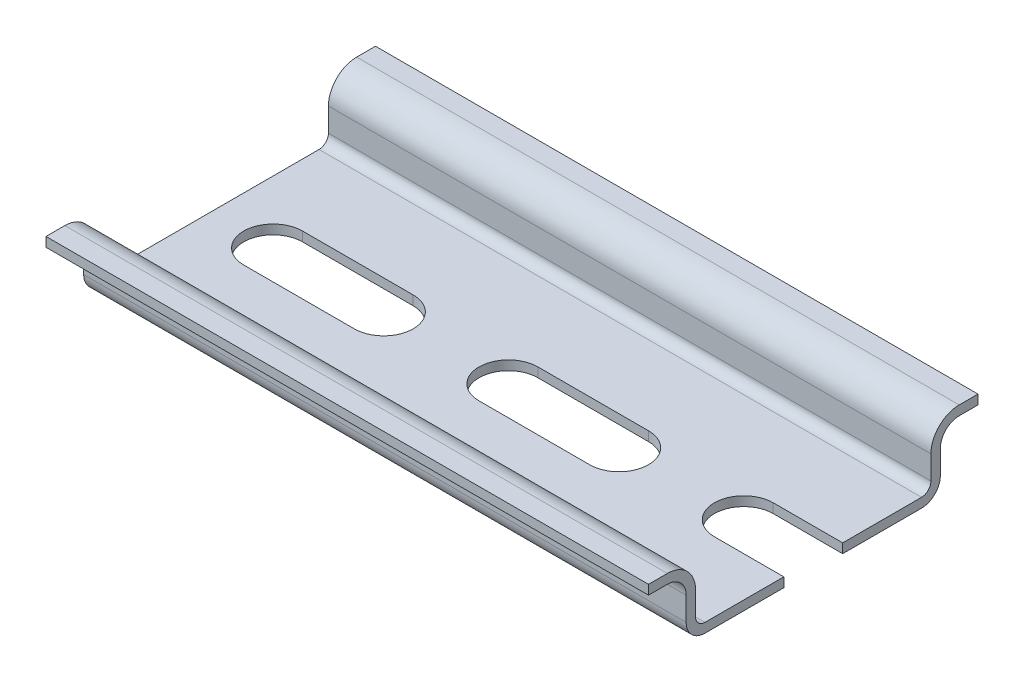
ISO-10303-21;
HEADER;
FILE_DESCRIPTION(('STEP AP214'),'2;1');
FILE_NAME('part.step','',(''),(''),'','','');
FILE_SCHEMA(('AUTOMOTIVE_DESIGN { 1 0 10303 214 1 1 1 1 }'));
ENDSEC;
DATA;
#1=APPLICATION_CONTEXT('core data for automotive mechanical design processes');
#2=APPLICATION_PROTOCOL_DEFINITION('international standard','automotive_design',2000,#1);
#3=PRODUCT_CONTEXT('',#1,'mechanical');
#4=PRODUCT('Part','Part','',(#3));
#5=PRODUCT_RELATED_PRODUCT_CATEGORY('part','',(#4));
#6=PRODUCT_DEFINITION_FORMATION('','',#4);
#7=PRODUCT_DEFINITION_CONTEXT('part definition',#1,'design');
#8=PRODUCT_DEFINITION('design','',#6,#7);
#9=PRODUCT_DEFINITION_SHAPE('','',#8);
#10=(LENGTH_UNIT() NAMED_UNIT(*) SI_UNIT(.MILLI.,.METRE.));
#11=(NAMED_UNIT(*) PLANE_ANGLE_UNIT() SI_UNIT($,.RADIAN.));
#12=(NAMED_UNIT(*) SI_UNIT($,.STERADIAN.) SOLID_ANGLE_UNIT());
#13=UNCERTAINTY_MEASURE_WITH_UNIT(LENGTH_MEASURE(1.E-05),#10,'distance_accuracy_value','');
#14=(GEOMETRIC_REPRESENTATION_CONTEXT(3) GLOBAL_UNCERTAINTY_ASSIGNED_CONTEXT((#13)) GLOBAL_UNIT_ASSIGNED_CONTEXT((#10,
#11,#12)) REPRESENTATION_CONTEXT('',''));
#15=CARTESIAN_POINT('',(0.,0.,0.));
#16=DIRECTION('',(0.,0.,1.));
#17=DIRECTION('',(1.,0.,0.));
#18=AXIS2_PLACEMENT_3D('',#15,#16,#17);
#19=CARTESIAN_POINT('',(-37.5,7.5,15.5));
#20=DIRECTION('',(0.,1.,0.));
#21=DIRECTION('',(0.,0.,1.));
#22=AXIS2_PLACEMENT_3D('',#19,#20,#21);
#23=PLANE('',#22);
#24=DIRECTION('',(1.,0.,0.));
#25=VECTOR('',#24,1.);
#26=CARTESIAN_POINT('',(-37.5,7.5,17.5));
#27=LINE('',#26,#25);
#28=CARTESIAN_POINT('',(-37.5,7.5,17.5));
#29=VERTEX_POINT('',#28);
#30=CARTESIAN_POINT('',(26.5,7.5,17.5));
#31=VERTEX_POINT('',#30);
#32=EDGE_CURVE('E253',#29,#31,#27,.T.);
#33=ORIENTED_EDGE('',*,*,#32,.T.);
#34=DIRECTION('',(0.,0.,1.));
#35=VECTOR('',#34,1.);
#36=CARTESIAN_POINT('',(26.5,7.5,15.5));
#37=LINE('',#36,#35);
#38=CARTESIAN_POINT('',(26.5,7.5,15.5));
#39=VERTEX_POINT('',#38);
#40=EDGE_CURVE('E240',#39,#31,#37,.T.);
#41=ORIENTED_EDGE('',*,*,#40,.F.);
#42=DIRECTION('',(1.,0.,0.));
#43=VECTOR('',#42,1.);
#44=CARTESIAN_POINT('',(-37.5,7.5,15.5));
#45=LINE('',#44,#43);
#46=CARTESIAN_POINT('',(-37.5,7.5,15.5));
#47=VERTEX_POINT('',#46);
#48=EDGE_CURVE('E39',#47,#39,#45,.T.);
#49=ORIENTED_EDGE('',*,*,#48,.F.);
#50=DIRECTION('',(0.,0.,-1.));
#51=VECTOR('',#50,1.);
#52=CARTESIAN_POINT('',(-37.5,7.5,15.5));
#53=LINE('',#52,#51);
#54=EDGE_CURVE('E361',#47,#29,#53,.F.);
#55=ORIENTED_EDGE('',*,*,#54,.T.);
#56=EDGE_LOOP('',(#33,#41,#49,#55));
#57=FACE_BOUND('',#56,.T.);
#58=ADVANCED_FACE('F32',(#57),#23,.T.);
#59=CARTESIAN_POINT('',(-37.5,4.5,15.5));
#60=DIRECTION('',(1.,0.,0.));
#61=DIRECTION('',(0.,0.,-1.));
#62=AXIS2_PLACEMENT_3D('',#59,#60,#61);
#63=CYLINDRICAL_SURFACE('',#62,3.);
#64=ORIENTED_EDGE('',*,*,#48,.T.);
#65=CARTESIAN_POINT('',(26.5,4.5,15.5));
#66=DIRECTION('',(1.,0.,0.));
#67=DIRECTION('',(0.,0.,-1.));
#68=AXIS2_PLACEMENT_3D('',#65,#66,#67);
#69=CIRCLE('',#68,3.);
#70=CARTESIAN_POINT('',(26.5,4.5,12.5));
#71=VERTEX_POINT('',#70);
#72=EDGE_CURVE('E237',#71,#39,#69,.T.);
#73=ORIENTED_EDGE('',*,*,#72,.F.);
#74=DIRECTION('',(1.,0.,0.));
#75=VECTOR('',#74,1.);
#76=CARTESIAN_POINT('',(-37.5,4.5,12.5));
#77=LINE('',#76,#75);
#78=CARTESIAN_POINT('',(-37.5,4.5,12.5));
#79=VERTEX_POINT('',#78);
#80=EDGE_CURVE('E260',#79,#71,#77,.T.);
#81=ORIENTED_EDGE('',*,*,#80,.F.);
#82=CARTESIAN_POINT('',(-37.5,4.5,15.5));
#83=DIRECTION('',(1.,0.,0.));
#84=DIRECTION('',(0.,0.,-1.));
#85=AXIS2_PLACEMENT_3D('',#82,#83,#84);
#86=CIRCLE('',#85,3.);
#87=EDGE_CURVE('E259',#79,#47,#86,.T.);
#88=ORIENTED_EDGE('',*,*,#87,.T.);
#89=EDGE_LOOP('',(#64,#73,#81,#88));
#90=FACE_BOUND('',#89,.T.);
#91=ADVANCED_FACE('F257',(#90),#63,.T.);
#92=CARTESIAN_POINT('',(-37.5,2.,12.5));
#93=DIRECTION('',(0.,0.,-1.));
#94=DIRECTION('',(-1.,0.,0.));
#95=AXIS2_PLACEMENT_3D('',#92,#93,#94);
#96=PLANE('',#95);
#97=ORIENTED_EDGE('',*,*,#80,.T.);
#98=DIRECTION('',(0.,1.,0.));
#99=VECTOR('',#98,1.);
#100=CARTESIAN_POINT('',(26.5,2.,12.5));
#101=LINE('',#100,#99);
#102=CARTESIAN_POINT('',(26.5,2.,12.5));
#103=VERTEX_POINT('',#102);
#104=EDGE_CURVE('E243',#103,#71,#101,.T.);
#105=ORIENTED_EDGE('',*,*,#104,.F.);
#106=DIRECTION('',(1.,0.,0.));
#107=VECTOR('',#106,1.);
#108=CARTESIAN_POINT('',(-37.5,2.,12.5));
#109=LINE('',#108,#107);
#110=CARTESIAN_POINT('',(-37.5,2.,12.5));
#111=VERTEX_POINT('',#110);
#112=EDGE_CURVE('E262',#111,#103,#109,.T.);
#113=ORIENTED_EDGE('',*,*,#112,.F.);
#114=DIRECTION('',(0.,1.,0.));
#115=VECTOR('',#114,1.);
#116=CARTESIAN_POINT('',(-37.5,2.,12.5));
#117=LINE('',#116,#115);
#118=EDGE_CURVE('E316',#111,#79,#117,.T.);
#119=ORIENTED_EDGE('',*,*,#118,.T.);
#120=EDGE_LOOP('',(#97,#105,#113,#119));
#121=FACE_BOUND('',#120,.T.);
#122=ADVANCED_FACE('F530',(#121),#96,.T.);
#123=CARTESIAN_POINT('',(-37.5,2.,11.5));
#124=DIRECTION('',(1.,0.,0.));
#125=DIRECTION('',(0.,0.,-1.));
#126=AXIS2_PLACEMENT_3D('',#123,#124,#125);
#127=CYLINDRICAL_SURFACE('',#126,0.999999999999999);
#128=ORIENTED_EDGE('',*,*,#112,.T.);
#129=CARTESIAN_POINT('',(26.5,2.,11.5));
#130=DIRECTION('',(-1.,0.,0.));
#131=DIRECTION('',(0.,0.,-1.));
#132=AXIS2_PLACEMENT_3D('',#129,#130,#131);
#133=CIRCLE('',#132,0.999999999999998);
#134=CARTESIAN_POINT('',(26.5,1.,11.5));
#135=VERTEX_POINT('',#134);
#136=EDGE_CURVE('E451',#135,#103,#133,.T.);
#137=ORIENTED_EDGE('',*,*,#136,.F.);
#138=DIRECTION('',(1.,0.,0.));
#139=VECTOR('',#138,1.);
#140=CARTESIAN_POINT('',(-37.5,1.,11.5));
#141=LINE('',#140,#139);
#142=CARTESIAN_POINT('',(-37.5,1.,11.5));
#143=VERTEX_POINT('',#142);
#144=EDGE_CURVE('E269',#143,#135,#141,.T.);
#145=ORIENTED_EDGE('',*,*,#144,.F.);
#146=CARTESIAN_POINT('',(-37.5,2.,11.5));
#147=DIRECTION('',(1.,0.,0.));
#148=DIRECTION('',(0.,0.,-1.));
#149=AXIS2_PLACEMENT_3D('',#146,#147,#148);
#150=CIRCLE('',#149,0.999999999999999);
#151=EDGE_CURVE('E318',#143,#111,#150,.F.);
#152=ORIENTED_EDGE('',*,*,#151,.T.);
#153=EDGE_LOOP('',(#128,#137,#145,#152));
#154=FACE_BOUND('',#153,.T.);
#155=ADVANCED_FACE('F528',(#154),#127,.F.);
#156=CARTESIAN_POINT('',(-37.5,1.,11.5));
#157=DIRECTION('',(0.,1.,0.));
#158=DIRECTION('',(0.,0.,1.));
#159=AXIS2_PLACEMENT_3D('',#156,#157,#158);
#160=PLANE('',#159);
#161=CARTESIAN_POINT('',(-19.125,0.999999999999999,0.));
#162=DIRECTION('',(0.,1.,0.));
#163=DIRECTION('',(0.,0.,1.));
#164=AXIS2_PLACEMENT_3D('',#161,#162,#163);
#165=CIRCLE('',#164,3.125);
#166=CARTESIAN_POINT('',(-19.125,0.999999999999999,-3.125));
#167=VERTEX_POINT('',#166);
#168=CARTESIAN_POINT('',(-19.125,0.999999999999999,3.125));
#169=VERTEX_POINT('',#168);
#170=EDGE_CURVE('E418',#167,#169,#165,.F.);
#171=ORIENTED_EDGE('',*,*,#170,.T.);
#172=DIRECTION('',(-1.,0.,0.));
#173=VECTOR('',#172,1.);
#174=CARTESIAN_POINT('',(-30.875,0.999999999999999,3.125));
#175=LINE('',#174,#173);
#176=CARTESIAN_POINT('',(-30.875,1.,3.125));
#177=VERTEX_POINT('',#176);
#178=EDGE_CURVE('E395',#169,#177,#175,.T.);
#179=ORIENTED_EDGE('',*,*,#178,.T.);
#180=CARTESIAN_POINT('',(-30.875,0.999999999999999,0.));
#181=DIRECTION('',(0.,1.,0.));
#182=DIRECTION('',(0.,0.,1.));
#183=AXIS2_PLACEMENT_3D('',#180,#181,#182);
#184=CIRCLE('',#183,3.125);
#185=CARTESIAN_POINT('',(-30.875,0.999999999999999,-3.125));
#186=VERTEX_POINT('',#185);
#187=EDGE_CURVE('E424',#177,#186,#184,.F.);
#188=ORIENTED_EDGE('',*,*,#187,.T.);
#189=DIRECTION('',(1.,0.,0.));
#190=VECTOR('',#189,1.);
#191=CARTESIAN_POINT('',(-30.875,0.999999999999999,-3.125));
#192=LINE('',#191,#190);
#193=EDGE_CURVE('E421',#186,#167,#192,.T.);
#194=ORIENTED_EDGE('',*,*,#193,.T.);
#195=EDGE_LOOP('',(#171,#179,#188,#194));
#196=FACE_BOUND('',#195,.T.);
#197=CARTESIAN_POINT('',(5.875,0.999999999999999,0.));
#198=DIRECTION('',(0.,1.,0.));
#199=DIRECTION('',(0.,0.,1.));
#200=AXIS2_PLACEMENT_3D('',#197,#198,#199);
#201=CIRCLE('',#200,3.125);
#202=CARTESIAN_POINT('',(5.875,0.999999999999999,-3.125));
#203=VERTEX_POINT('',#202);
#204=CARTESIAN_POINT('',(5.875,0.999999999999999,3.125));
#205=VERTEX_POINT('',#204);
#206=EDGE_CURVE('E386',#203,#205,#201,.F.);
#207=ORIENTED_EDGE('',*,*,#206,.T.);
#208=DIRECTION('',(-1.,0.,0.));
#209=VECTOR('',#208,1.);
#210=CARTESIAN_POINT('',(-5.875,0.999999999999999,3.125));
#211=LINE('',#210,#209);
#212=CARTESIAN_POINT('',(-5.875,1.,3.125));
#213=VERTEX_POINT('',#212);
#214=EDGE_CURVE('E363',#205,#213,#211,.T.);
#215=ORIENTED_EDGE('',*,*,#214,.T.);
#216=CARTESIAN_POINT('',(-5.875,0.999999999999999,0.));
#217=DIRECTION('',(0.,1.,0.));
#218=DIRECTION('',(0.,0.,1.));
#219=AXIS2_PLACEMENT_3D('',#216,#217,#218);
#220=CIRCLE('',#219,3.125);
#221=CARTESIAN_POINT('',(-5.875,0.999999999999999,-3.125));
#222=VERTEX_POINT('',#221);
#223=EDGE_CURVE('E392',#213,#222,#220,.F.);
#224=ORIENTED_EDGE('',*,*,#223,.T.);
#225=DIRECTION('',(1.,0.,0.));
#226=VECTOR('',#225,1.);
#227=CARTESIAN_POINT('',(-5.875,0.999999999999999,-3.125));
#228=LINE('',#227,#226);
#229=EDGE_CURVE('E389',#222,#203,#228,.T.);
#230=ORIENTED_EDGE('',*,*,#229,.T.);
#231=EDGE_LOOP('',(#207,#215,#224,#230));
#232=FACE_BOUND('',#231,.T.);
#233=ORIENTED_EDGE('',*,*,#144,.T.);
#234=DIRECTION('',(0.,0.,1.));
#235=VECTOR('',#234,1.);
#236=CARTESIAN_POINT('',(26.5,1.,-11.5));
#237=LINE('',#236,#235);
#238=CARTESIAN_POINT('',(26.5,1.,3.125));
#239=VERTEX_POINT('',#238);
#240=EDGE_CURVE('E454',#239,#135,#237,.T.);
#241=ORIENTED_EDGE('',*,*,#240,.F.);
#242=DIRECTION('',(-1.,0.,0.));
#243=VECTOR('',#242,1.);
#244=CARTESIAN_POINT('',(19.125,0.999999999999999,3.125));
#245=LINE('',#244,#243);
#246=CARTESIAN_POINT('',(19.125,1.,3.125));
#247=VERTEX_POINT('',#246);
#248=EDGE_CURVE('E427',#239,#247,#245,.T.);
#249=ORIENTED_EDGE('',*,*,#248,.T.);
#250=CARTESIAN_POINT('',(19.125,0.999999999999999,0.));
#251=DIRECTION('',(0.,1.,0.));
#252=DIRECTION('',(0.,0.,1.));
#253=AXIS2_PLACEMENT_3D('',#250,#251,#252);
#254=CIRCLE('',#253,3.125);
#255=CARTESIAN_POINT('',(19.125,0.999999999999999,-3.125));
#256=VERTEX_POINT('',#255);
#257=EDGE_CURVE('E445',#247,#256,#254,.F.);
#258=ORIENTED_EDGE('',*,*,#257,.T.);
#259=DIRECTION('',(1.,0.,0.));
#260=VECTOR('',#259,1.);
#261=CARTESIAN_POINT('',(19.125,0.999999999999999,-3.125));
#262=LINE('',#261,#260);
#263=CARTESIAN_POINT('',(26.5,0.999999999999999,-3.125));
#264=VERTEX_POINT('',#263);
#265=EDGE_CURVE('E442',#256,#264,#262,.T.);
#266=ORIENTED_EDGE('',*,*,#265,.T.);
#267=CARTESIAN_POINT('',(26.5,1.,-11.5));
#268=VERTEX_POINT('',#267);
#269=EDGE_CURVE('E46',#268,#264,#237,.T.);
#270=ORIENTED_EDGE('',*,*,#269,.F.);
#271=DIRECTION('',(1.,0.,0.));
#272=VECTOR('',#271,1.);
#273=CARTESIAN_POINT('',(-37.5,1.,-11.5));
#274=LINE('',#273,#272);
#275=CARTESIAN_POINT('',(-37.5,1.,-11.5));
#276=VERTEX_POINT('',#275);
#277=EDGE_CURVE('E272',#276,#268,#274,.T.);
#278=ORIENTED_EDGE('',*,*,#277,.F.);
#279=DIRECTION('',(0.,0.,-1.));
#280=VECTOR('',#279,1.);
#281=CARTESIAN_POINT('',(-37.5,1.,11.5));
#282=LINE('',#281,#280);
#283=EDGE_CURVE('E322',#276,#143,#282,.F.);
#284=ORIENTED_EDGE('',*,*,#283,.T.);
#285=EDGE_LOOP('',(#233,#241,#249,#258,#266,#270,#278,#284));
#286=FACE_BOUND('',#285,.T.);
#287=ADVANCED_FACE('F524',(#196,#232,#286),#160,.T.);
#288=CARTESIAN_POINT('',(-37.5,2.,-11.5));
#289=DIRECTION('',(1.,0.,0.));
#290=DIRECTION('',(0.,0.,-1.));
#291=AXIS2_PLACEMENT_3D('',#288,#289,#290);
#292=CYLINDRICAL_SURFACE('',#291,0.999999999999999);
#293=ORIENTED_EDGE('',*,*,#277,.T.);
#294=CARTESIAN_POINT('',(26.5,2.,-11.5));
#295=DIRECTION('',(-1.,0.,0.));
#296=DIRECTION('',(0.,0.,-1.));
#297=AXIS2_PLACEMENT_3D('',#294,#295,#296);
#298=CIRCLE('',#297,1.);
#299=CARTESIAN_POINT('',(26.5,2.,-12.5));
#300=VERTEX_POINT('',#299);
#301=EDGE_CURVE('E455',#300,#268,#298,.T.);
#302=ORIENTED_EDGE('',*,*,#301,.F.);
#303=DIRECTION('',(1.,0.,0.));
#304=VECTOR('',#303,1.);
#305=CARTESIAN_POINT('',(-37.5,2.,-12.5));
#306=LINE('',#305,#304);
#307=CARTESIAN_POINT('',(-37.5,2.,-12.5));
#308=VERTEX_POINT('',#307);
#309=EDGE_CURVE('E275',#308,#300,#306,.T.);
#310=ORIENTED_EDGE('',*,*,#309,.F.);
#311=CARTESIAN_POINT('',(-37.5,2.,-11.5));
#312=DIRECTION('',(1.,0.,0.));
#313=DIRECTION('',(0.,0.,-1.));
#314=AXIS2_PLACEMENT_3D('',#311,#312,#313);
#315=CIRCLE('',#314,0.999999999999999);
#316=EDGE_CURVE('E327',#308,#276,#315,.F.);
#317=ORIENTED_EDGE('',*,*,#316,.T.);
#318=EDGE_LOOP('',(#293,#302,#310,#317));
#319=FACE_BOUND('',#318,.T.);
#320=ADVANCED_FACE('F535',(#319),#292,.F.);
#321=CARTESIAN_POINT('',(-37.5,2.,-12.5));
#322=DIRECTION('',(0.,0.,1.));
#323=DIRECTION('',(1.,0.,0.));
#324=AXIS2_PLACEMENT_3D('',#321,#322,#323);
#325=PLANE('',#324);
#326=ORIENTED_EDGE('',*,*,#309,.T.);
#327=DIRECTION('',(0.,-1.,0.));
#328=VECTOR('',#327,1.);
#329=CARTESIAN_POINT('',(26.5,4.5,-12.5));
#330=LINE('',#329,#328);
#331=CARTESIAN_POINT('',(26.5,4.5,-12.5));
#332=VERTEX_POINT('',#331);
#333=EDGE_CURVE('E457',#332,#300,#330,.T.);
#334=ORIENTED_EDGE('',*,*,#333,.F.);
#335=DIRECTION('',(1.,0.,0.));
#336=VECTOR('',#335,1.);
#337=CARTESIAN_POINT('',(-37.5,4.5,-12.5));
#338=LINE('',#337,#336);
#339=CARTESIAN_POINT('',(-37.5,4.5,-12.5));
#340=VERTEX_POINT('',#339);
#341=EDGE_CURVE('E278',#340,#332,#338,.T.);
#342=ORIENTED_EDGE('',*,*,#341,.F.);
#343=DIRECTION('',(0.,1.,0.));
#344=VECTOR('',#343,1.);
#345=CARTESIAN_POINT('',(-37.5,2.,-12.5));
#346=LINE('',#345,#344);
#347=EDGE_CURVE('E330',#340,#308,#346,.F.);
#348=ORIENTED_EDGE('',*,*,#347,.T.);
#349=EDGE_LOOP('',(#326,#334,#342,#348));
#350=FACE_BOUND('',#349,.T.);
#351=ADVANCED_FACE('F539',(#350),#325,.T.);
#352=CARTESIAN_POINT('',(-37.5,4.5,-15.5));
#353=DIRECTION('',(1.,0.,0.));
#354=DIRECTION('',(0.,0.,-1.));
#355=AXIS2_PLACEMENT_3D('',#352,#353,#354);
#356=CYLINDRICAL_SURFACE('',#355,3.);
#357=ORIENTED_EDGE('',*,*,#341,.T.);
#358=CARTESIAN_POINT('',(26.5,4.5,-15.5));
#359=DIRECTION('',(1.,0.,0.));
#360=DIRECTION('',(0.,0.,-1.));
#361=AXIS2_PLACEMENT_3D('',#358,#359,#360);
#362=CIRCLE('',#361,3.);
#363=CARTESIAN_POINT('',(26.5,7.5,-15.5));
#364=VERTEX_POINT('',#363);
#365=EDGE_CURVE('E459',#364,#332,#362,.T.);
#366=ORIENTED_EDGE('',*,*,#365,.F.);
#367=DIRECTION('',(1.,0.,0.));
#368=VECTOR('',#367,1.);
#369=CARTESIAN_POINT('',(-37.5,7.5,-15.5));
#370=LINE('',#369,#368);
#371=CARTESIAN_POINT('',(-37.5,7.5,-15.5));
#372=VERTEX_POINT('',#371);
#373=EDGE_CURVE('E281',#372,#364,#370,.T.);
#374=ORIENTED_EDGE('',*,*,#373,.F.);
#375=CARTESIAN_POINT('',(-37.5,4.5,-15.5));
#376=DIRECTION('',(1.,0.,0.));
#377=DIRECTION('',(0.,0.,-1.));
#378=AXIS2_PLACEMENT_3D('',#375,#376,#377);
#379=CIRCLE('',#378,3.);
#380=EDGE_CURVE('E333',#372,#340,#379,.T.);
#381=ORIENTED_EDGE('',*,*,#380,.T.);
#382=EDGE_LOOP('',(#357,#366,#374,#381));
#383=FACE_BOUND('',#382,.T.);
#384=ADVANCED_FACE('F543',(#383),#356,.T.);
#385=CARTESIAN_POINT('',(-37.5,7.5,-15.5));
#386=DIRECTION('',(0.,1.,0.));
#387=DIRECTION('',(0.,0.,1.));
#388=AXIS2_PLACEMENT_3D('',#385,#386,#387);
#389=PLANE('',#388);
#390=ORIENTED_EDGE('',*,*,#373,.T.);
#391=DIRECTION('',(0.,0.,1.));
#392=VECTOR('',#391,1.);
#393=CARTESIAN_POINT('',(26.5,7.5,-17.5));
#394=LINE('',#393,#392);
#395=CARTESIAN_POINT('',(26.5,7.5,-17.5));
#396=VERTEX_POINT('',#395);
#397=EDGE_CURVE('E461',#396,#364,#394,.T.);
#398=ORIENTED_EDGE('',*,*,#397,.F.);
#399=DIRECTION('',(1.,0.,0.));
#400=VECTOR('',#399,1.);
#401=CARTESIAN_POINT('',(-37.5,7.5,-17.5));
#402=LINE('',#401,#400);
#403=CARTESIAN_POINT('',(-37.5,7.5,-17.5));
#404=VERTEX_POINT('',#403);
#405=EDGE_CURVE('E284',#404,#396,#402,.T.);
#406=ORIENTED_EDGE('',*,*,#405,.F.);
#407=DIRECTION('',(0.,0.,-1.));
#408=VECTOR('',#407,1.);
#409=CARTESIAN_POINT('',(-37.5,7.5,-15.5));
#410=LINE('',#409,#408);
#411=EDGE_CURVE('E336',#404,#372,#410,.F.);
#412=ORIENTED_EDGE('',*,*,#411,.T.);
#413=EDGE_LOOP('',(#390,#398,#406,#412));
#414=FACE_BOUND('',#413,.T.);
#415=ADVANCED_FACE('F546',(#414),#389,.T.);
#416=CARTESIAN_POINT('',(-37.5,7.5,-17.5));
#417=DIRECTION('',(0.,0.,1.));
#418=DIRECTION('',(1.,0.,0.));
#419=AXIS2_PLACEMENT_3D('',#416,#417,#418);
#420=PLANE('',#419);
#421=DIRECTION('',(0.,1.,0.));
#422=VECTOR('',#421,1.);
#423=CARTESIAN_POINT('',(26.5,6.5,-17.5));
#424=LINE('',#423,#422);
#425=CARTESIAN_POINT('',(26.5,6.5,-17.5));
#426=VERTEX_POINT('',#425);
#427=EDGE_CURVE('E463',#426,#396,#424,.T.);
#428=ORIENTED_EDGE('',*,*,#427,.F.);
#429=DIRECTION('',(1.,0.,0.));
#430=VECTOR('',#429,1.);
#431=CARTESIAN_POINT('',(-37.5,6.5,-17.5));
#432=LINE('',#431,#430);
#433=CARTESIAN_POINT('',(-37.5,6.5,-17.5));
#434=VERTEX_POINT('',#433);
#435=EDGE_CURVE('E287',#434,#426,#432,.T.);
#436=ORIENTED_EDGE('',*,*,#435,.F.);
#437=DIRECTION('',(0.,-1.,0.));
#438=VECTOR('',#437,1.);
#439=CARTESIAN_POINT('',(-37.5,7.5,-17.5));
#440=LINE('',#439,#438);
#441=EDGE_CURVE('E339',#404,#434,#440,.T.);
#442=ORIENTED_EDGE('',*,*,#441,.F.);
#443=ORIENTED_EDGE('',*,*,#405,.T.);
#444=EDGE_LOOP('',(#428,#436,#442,#443));
#445=FACE_BOUND('',#444,.T.);
#446=ADVANCED_FACE('F552',(#445),#420,.F.);
#447=CARTESIAN_POINT('',(-37.5,6.5,-15.5));
#448=DIRECTION('',(0.,1.,0.));
#449=DIRECTION('',(0.,0.,1.));
#450=AXIS2_PLACEMENT_3D('',#447,#448,#449);
#451=PLANE('',#450);
#452=DIRECTION('',(0.,0.,-1.));
#453=VECTOR('',#452,1.);
#454=CARTESIAN_POINT('',(26.5,6.5,-15.5));
#455=LINE('',#454,#453);
#456=CARTESIAN_POINT('',(26.5,6.5,-15.5));
#457=VERTEX_POINT('',#456);
#458=EDGE_CURVE('E465',#457,#426,#455,.T.);
#459=ORIENTED_EDGE('',*,*,#458,.F.);
#460=DIRECTION('',(1.,0.,0.));
#461=VECTOR('',#460,1.);
#462=CARTESIAN_POINT('',(-37.5,6.5,-15.5));
#463=LINE('',#462,#461);
#464=CARTESIAN_POINT('',(-37.5,6.5,-15.5));
#465=VERTEX_POINT('',#464);
#466=EDGE_CURVE('E290',#465,#457,#463,.T.);
#467=ORIENTED_EDGE('',*,*,#466,.F.);
#468=DIRECTION('',(0.,0.,1.));
#469=VECTOR('',#468,1.);
#470=CARTESIAN_POINT('',(-37.5,6.5,-15.5));
#471=LINE('',#470,#469);
#472=EDGE_CURVE('E341',#434,#465,#471,.T.);
#473=ORIENTED_EDGE('',*,*,#472,.F.);
#474=ORIENTED_EDGE('',*,*,#435,.T.);
#475=EDGE_LOOP('',(#459,#467,#473,#474));
#476=FACE_BOUND('',#475,.T.);
#477=ADVANCED_FACE('F559',(#476),#451,.F.);
#478=CARTESIAN_POINT('',(-37.5,4.5,-15.5));
#479=DIRECTION('',(1.,0.,0.));
#480=DIRECTION('',(0.,0.,-1.));
#481=AXIS2_PLACEMENT_3D('',#478,#479,#480);
#482=CYLINDRICAL_SURFACE('',#481,2.);
#483=CARTESIAN_POINT('',(26.5,4.5,-15.5));
#484=DIRECTION('',(-1.,0.,0.));
#485=DIRECTION('',(0.,0.,-1.));
#486=AXIS2_PLACEMENT_3D('',#483,#484,#485);
#487=CIRCLE('',#486,2.);
#488=CARTESIAN_POINT('',(26.5,4.5,-13.5));
#489=VERTEX_POINT('',#488);
#490=EDGE_CURVE('E467',#489,#457,#487,.T.);
#491=ORIENTED_EDGE('',*,*,#490,.F.);
#492=DIRECTION('',(1.,0.,0.));
#493=VECTOR('',#492,1.);
#494=CARTESIAN_POINT('',(-37.5,4.5,-13.5));
#495=LINE('',#494,#493);
#496=CARTESIAN_POINT('',(-37.5,4.5,-13.5));
#497=VERTEX_POINT('',#496);
#498=EDGE_CURVE('E293',#497,#489,#495,.T.);
#499=ORIENTED_EDGE('',*,*,#498,.F.);
#500=CARTESIAN_POINT('',(-37.5,4.5,-15.5));
#501=DIRECTION('',(1.,0.,0.));
#502=DIRECTION('',(0.,0.,-1.));
#503=AXIS2_PLACEMENT_3D('',#500,#501,#502);
#504=CIRCLE('',#503,2.);
#505=EDGE_CURVE('E343',#465,#497,#504,.T.);
#506=ORIENTED_EDGE('',*,*,#505,.F.);
#507=ORIENTED_EDGE('',*,*,#466,.T.);
#508=EDGE_LOOP('',(#491,#499,#506,#507));
#509=FACE_BOUND('',#508,.T.);
#510=ADVANCED_FACE('F562',(#509),#482,.F.);
#511=CARTESIAN_POINT('',(-37.5,2.,-13.5));
#512=DIRECTION('',(0.,0.,1.));
#513=DIRECTION('',(1.,0.,0.));
#514=AXIS2_PLACEMENT_3D('',#511,#512,#513);
#515=PLANE('',#514);
#516=DIRECTION('',(0.,1.,0.));
#517=VECTOR('',#516,1.);
#518=CARTESIAN_POINT('',(26.5,2.,-13.5));
#519=LINE('',#518,#517);
#520=CARTESIAN_POINT('',(26.5,2.,-13.5));
#521=VERTEX_POINT('',#520);
#522=EDGE_CURVE('E469',#521,#489,#519,.T.);
#523=ORIENTED_EDGE('',*,*,#522,.F.);
#524=DIRECTION('',(1.,0.,0.));
#525=VECTOR('',#524,1.);
#526=CARTESIAN_POINT('',(-37.5,2.,-13.5));
#527=LINE('',#526,#525);
#528=CARTESIAN_POINT('',(-37.5,2.,-13.5));
#529=VERTEX_POINT('',#528);
#530=EDGE_CURVE('E296',#529,#521,#527,.T.);
#531=ORIENTED_EDGE('',*,*,#530,.F.);
#532=DIRECTION('',(0.,-1.,0.));
#533=VECTOR('',#532,1.);
#534=CARTESIAN_POINT('',(-37.5,2.,-13.5));
#535=LINE('',#534,#533);
#536=EDGE_CURVE('E345',#497,#529,#535,.T.);
#537=ORIENTED_EDGE('',*,*,#536,.F.);
#538=ORIENTED_EDGE('',*,*,#498,.T.);
#539=EDGE_LOOP('',(#523,#531,#537,#538));
#540=FACE_BOUND('',#539,.T.);
#541=ADVANCED_FACE('F567',(#540),#515,.F.);
#542=CARTESIAN_POINT('',(-37.5,2.,-11.5));
#543=DIRECTION('',(1.,0.,0.));
#544=DIRECTION('',(0.,0.,-1.));
#545=AXIS2_PLACEMENT_3D('',#542,#543,#544);
#546=CYLINDRICAL_SURFACE('',#545,2.);
#547=CARTESIAN_POINT('',(26.5,2.,-11.5));
#548=DIRECTION('',(1.,0.,0.));
#549=DIRECTION('',(0.,0.,-1.));
#550=AXIS2_PLACEMENT_3D('',#547,#548,#549);
#551=CIRCLE('',#550,2.);
#552=CARTESIAN_POINT('',(26.5,0.,-11.5));
#553=VERTEX_POINT('',#552);
#554=EDGE_CURVE('E471',#553,#521,#551,.T.);
#555=ORIENTED_EDGE('',*,*,#554,.F.);
#556=DIRECTION('',(1.,0.,0.));
#557=VECTOR('',#556,1.);
#558=CARTESIAN_POINT('',(-37.5,0.,-11.5));
#559=LINE('',#558,#557);
#560=CARTESIAN_POINT('',(-37.5,0.,-11.5));
#561=VERTEX_POINT('',#560);
#562=EDGE_CURVE('E299',#561,#553,#559,.T.);
#563=ORIENTED_EDGE('',*,*,#562,.F.);
#564=CARTESIAN_POINT('',(-37.5,2.,-11.5));
#565=DIRECTION('',(-1.,0.,0.));
#566=DIRECTION('',(0.,0.,1.));
#567=AXIS2_PLACEMENT_3D('',#564,#565,#566);
#568=CIRCLE('',#567,2.);
#569=EDGE_CURVE('E347',#529,#561,#568,.T.);
#570=ORIENTED_EDGE('',*,*,#569,.F.);
#571=ORIENTED_EDGE('',*,*,#530,.T.);
#572=EDGE_LOOP('',(#555,#563,#570,#571));
#573=FACE_BOUND('',#572,.T.);
#574=ADVANCED_FACE('F572',(#573),#546,.T.);
#575=CARTESIAN_POINT('',(-37.5,0.,11.5));
#576=DIRECTION('',(0.,1.,0.));
#577=DIRECTION('',(0.,0.,1.));
#578=AXIS2_PLACEMENT_3D('',#575,#576,#577);
#579=PLANE('',#578);
#580=DIRECTION('',(-1.,0.,0.));
#581=VECTOR('',#580,1.);
#582=CARTESIAN_POINT('',(-5.875,0.,3.125));
#583=LINE('',#582,#581);
#584=CARTESIAN_POINT('',(5.875,0.,3.125));
#585=VERTEX_POINT('',#584);
#586=CARTESIAN_POINT('',(-5.875,0.,3.125));
#587=VERTEX_POINT('',#586);
#588=EDGE_CURVE('E381',#585,#587,#583,.T.);
#589=ORIENTED_EDGE('',*,*,#588,.F.);
#590=CARTESIAN_POINT('',(5.875,0.,0.));
#591=DIRECTION('',(0.,-1.,0.));
#592=DIRECTION('',(0.,0.,1.));
#593=AXIS2_PLACEMENT_3D('',#590,#591,#592);
#594=CIRCLE('',#593,3.125);
#595=CARTESIAN_POINT('',(5.875,0.,-3.125));
#596=VERTEX_POINT('',#595);
#597=EDGE_CURVE('E384',#596,#585,#594,.T.);
#598=ORIENTED_EDGE('',*,*,#597,.F.);
#599=DIRECTION('',(1.,0.,0.));
#600=VECTOR('',#599,1.);
#601=CARTESIAN_POINT('',(-5.875,0.,-3.125));
#602=LINE('',#601,#600);
#603=CARTESIAN_POINT('',(-5.875,0.,-3.125));
#604=VERTEX_POINT('',#603);
#605=EDGE_CURVE('E371',#604,#596,#602,.T.);
#606=ORIENTED_EDGE('',*,*,#605,.F.);
#607=CARTESIAN_POINT('',(-5.875,0.,0.));
#608=DIRECTION('',(0.,-1.,0.));
#609=DIRECTION('',(0.,0.,-1.));
#610=AXIS2_PLACEMENT_3D('',#607,#608,#609);
#611=CIRCLE('',#610,3.125);
#612=EDGE_CURVE('E378',#587,#604,#611,.T.);
#613=ORIENTED_EDGE('',*,*,#612,.F.);
#614=EDGE_LOOP('',(#589,#598,#606,#613));
#615=FACE_BOUND('',#614,.T.);
#616=DIRECTION('',(-1.,0.,0.));
#617=VECTOR('',#616,1.);
#618=CARTESIAN_POINT('',(-30.875,0.,3.125));
#619=LINE('',#618,#617);
#620=CARTESIAN_POINT('',(-19.125,0.,3.125));
#621=VERTEX_POINT('',#620);
#622=CARTESIAN_POINT('',(-30.875,0.,3.125));
#623=VERTEX_POINT('',#622);
#624=EDGE_CURVE('E413',#621,#623,#619,.T.);
#625=ORIENTED_EDGE('',*,*,#624,.F.);
#626=CARTESIAN_POINT('',(-19.125,0.,0.));
#627=DIRECTION('',(0.,-1.,0.));
#628=DIRECTION('',(0.,0.,1.));
#629=AXIS2_PLACEMENT_3D('',#626,#627,#628);
#630=CIRCLE('',#629,3.125);
#631=CARTESIAN_POINT('',(-19.125,0.,-3.125));
#632=VERTEX_POINT('',#631);
#633=EDGE_CURVE('E416',#632,#621,#630,.T.);
#634=ORIENTED_EDGE('',*,*,#633,.F.);
#635=DIRECTION('',(1.,0.,0.));
#636=VECTOR('',#635,1.);
#637=CARTESIAN_POINT('',(-30.875,0.,-3.125));
#638=LINE('',#637,#636);
#639=CARTESIAN_POINT('',(-30.875,0.,-3.125));
#640=VERTEX_POINT('',#639);
#641=EDGE_CURVE('E403',#640,#632,#638,.T.);
#642=ORIENTED_EDGE('',*,*,#641,.F.);
#643=CARTESIAN_POINT('',(-30.875,0.,0.));
#644=DIRECTION('',(0.,-1.,0.));
#645=DIRECTION('',(0.,0.,-1.));
#646=AXIS2_PLACEMENT_3D('',#643,#644,#645);
#647=CIRCLE('',#646,3.125);
#648=EDGE_CURVE('E410',#623,#640,#647,.T.);
#649=ORIENTED_EDGE('',*,*,#648,.F.);
#650=EDGE_LOOP('',(#625,#634,#642,#649));
#651=FACE_BOUND('',#650,.T.);
#652=DIRECTION('',(0.,0.,-1.));
#653=VECTOR('',#652,1.);
#654=CARTESIAN_POINT('',(26.5,0.,11.5));
#655=LINE('',#654,#653);
#656=CARTESIAN_POINT('',(26.5,0.,11.5));
#657=VERTEX_POINT('',#656);
#658=CARTESIAN_POINT('',(26.5,0.,3.125));
#659=VERTEX_POINT('',#658);
#660=EDGE_CURVE('E53',#657,#659,#655,.T.);
#661=ORIENTED_EDGE('',*,*,#660,.F.);
#662=DIRECTION('',(1.,0.,0.));
#663=VECTOR('',#662,1.);
#664=CARTESIAN_POINT('',(-37.5,0.,11.5));
#665=LINE('',#664,#663);
#666=CARTESIAN_POINT('',(-37.5,0.,11.5));
#667=VERTEX_POINT('',#666);
#668=EDGE_CURVE('E302',#667,#657,#665,.T.);
#669=ORIENTED_EDGE('',*,*,#668,.F.);
#670=DIRECTION('',(0.,0.,1.));
#671=VECTOR('',#670,1.);
#672=CARTESIAN_POINT('',(-37.5,0.,11.5));
#673=LINE('',#672,#671);
#674=EDGE_CURVE('E349',#561,#667,#673,.T.);
#675=ORIENTED_EDGE('',*,*,#674,.F.);
#676=ORIENTED_EDGE('',*,*,#562,.T.);
#677=CARTESIAN_POINT('',(26.5,0.,-3.125));
#678=VERTEX_POINT('',#677);
#679=EDGE_CURVE('E474',#678,#553,#655,.T.);
#680=ORIENTED_EDGE('',*,*,#679,.F.);
#681=DIRECTION('',(1.,0.,0.));
#682=VECTOR('',#681,1.);
#683=CARTESIAN_POINT('',(19.125,0.,-3.125));
#684=LINE('',#683,#682);
#685=CARTESIAN_POINT('',(19.125,0.,-3.125));
#686=VERTEX_POINT('',#685);
#687=EDGE_CURVE('E433',#686,#678,#684,.T.);
#688=ORIENTED_EDGE('',*,*,#687,.F.);
#689=CARTESIAN_POINT('',(19.125,0.,0.));
#690=DIRECTION('',(0.,-1.,0.));
#691=DIRECTION('',(0.,0.,-1.));
#692=AXIS2_PLACEMENT_3D('',#689,#690,#691);
#693=CIRCLE('',#692,3.125);
#694=CARTESIAN_POINT('',(19.125,0.,3.125));
#695=VERTEX_POINT('',#694);
#696=EDGE_CURVE('E437',#695,#686,#693,.T.);
#697=ORIENTED_EDGE('',*,*,#696,.F.);
#698=DIRECTION('',(-1.,0.,0.));
#699=VECTOR('',#698,1.);
#700=CARTESIAN_POINT('',(19.125,0.,3.125));
#701=LINE('',#700,#699);
#702=EDGE_CURVE('E440',#659,#695,#701,.T.);
#703=ORIENTED_EDGE('',*,*,#702,.F.);
#704=EDGE_LOOP('',(#661,#669,#675,#676,#680,#688,#697,#703));
#705=FACE_BOUND('',#704,.T.);
#706=ADVANCED_FACE('F511',(#615,#651,#705),#579,.F.);
#707=CARTESIAN_POINT('',(-37.5,2.,11.5));
#708=DIRECTION('',(1.,0.,0.));
#709=DIRECTION('',(0.,0.,-1.));
#710=AXIS2_PLACEMENT_3D('',#707,#708,#709);
#711=CYLINDRICAL_SURFACE('',#710,2.);
#712=CARTESIAN_POINT('',(26.5,2.,11.5));
#713=DIRECTION('',(1.,0.,0.));
#714=DIRECTION('',(0.,0.,-1.));
#715=AXIS2_PLACEMENT_3D('',#712,#713,#714);
#716=CIRCLE('',#715,2.);
#717=CARTESIAN_POINT('',(26.5,2.,13.5));
#718=VERTEX_POINT('',#717);
#719=EDGE_CURVE('E475',#718,#657,#716,.T.);
#720=ORIENTED_EDGE('',*,*,#719,.F.);
#721=DIRECTION('',(1.,0.,0.));
#722=VECTOR('',#721,1.);
#723=CARTESIAN_POINT('',(-37.5,2.,13.5));
#724=LINE('',#723,#722);
#725=CARTESIAN_POINT('',(-37.5,2.,13.5));
#726=VERTEX_POINT('',#725);
#727=EDGE_CURVE('E305',#726,#718,#724,.T.);
#728=ORIENTED_EDGE('',*,*,#727,.F.);
#729=CARTESIAN_POINT('',(-37.5,2.,11.5));
#730=DIRECTION('',(-1.,0.,0.));
#731=DIRECTION('',(0.,0.,-1.));
#732=AXIS2_PLACEMENT_3D('',#729,#730,#731);
#733=CIRCLE('',#732,2.);
#734=EDGE_CURVE('E351',#667,#726,#733,.T.);
#735=ORIENTED_EDGE('',*,*,#734,.F.);
#736=ORIENTED_EDGE('',*,*,#668,.T.);
#737=EDGE_LOOP('',(#720,#728,#735,#736));
#738=FACE_BOUND('',#737,.T.);
#739=ADVANCED_FACE('F507',(#738),#711,.T.);
#740=CARTESIAN_POINT('',(-37.5,2.,13.5));
#741=DIRECTION('',(0.,0.,-1.));
#742=DIRECTION('',(-1.,0.,0.));
#743=AXIS2_PLACEMENT_3D('',#740,#741,#742);
#744=PLANE('',#743);
#745=DIRECTION('',(0.,-1.,0.));
#746=VECTOR('',#745,1.);
#747=CARTESIAN_POINT('',(26.5,4.5,13.5));
#748=LINE('',#747,#746);
#749=CARTESIAN_POINT('',(26.5,4.5,13.5));
#750=VERTEX_POINT('',#749);
#751=EDGE_CURVE('E477',#750,#718,#748,.T.);
#752=ORIENTED_EDGE('',*,*,#751,.F.);
#753=DIRECTION('',(1.,0.,0.));
#754=VECTOR('',#753,1.);
#755=CARTESIAN_POINT('',(-37.5,4.5,13.5));
#756=LINE('',#755,#754);
#757=CARTESIAN_POINT('',(-37.5,4.5,13.5));
#758=VERTEX_POINT('',#757);
#759=EDGE_CURVE('E308',#758,#750,#756,.T.);
#760=ORIENTED_EDGE('',*,*,#759,.F.);
#761=DIRECTION('',(0.,1.,0.));
#762=VECTOR('',#761,1.);
#763=CARTESIAN_POINT('',(-37.5,2.,13.5));
#764=LINE('',#763,#762);
#765=EDGE_CURVE('E353',#726,#758,#764,.T.);
#766=ORIENTED_EDGE('',*,*,#765,.F.);
#767=ORIENTED_EDGE('',*,*,#727,.T.);
#768=EDGE_LOOP('',(#752,#760,#766,#767));
#769=FACE_BOUND('',#768,.T.);
#770=ADVANCED_FACE('F503',(#769),#744,.F.);
#771=CARTESIAN_POINT('',(-37.5,4.5,15.5));
#772=DIRECTION('',(1.,0.,0.));
#773=DIRECTION('',(0.,0.,-1.));
#774=AXIS2_PLACEMENT_3D('',#771,#772,#773);
#775=CYLINDRICAL_SURFACE('',#774,2.);
#776=CARTESIAN_POINT('',(26.5,4.5,15.5));
#777=DIRECTION('',(-1.,0.,0.));
#778=DIRECTION('',(0.,0.,-1.));
#779=AXIS2_PLACEMENT_3D('',#776,#777,#778);
#780=CIRCLE('',#779,2.);
#781=CARTESIAN_POINT('',(26.5,6.5,15.5));
#782=VERTEX_POINT('',#781);
#783=EDGE_CURVE('E479',#782,#750,#780,.T.);
#784=ORIENTED_EDGE('',*,*,#783,.F.);
#785=DIRECTION('',(1.,0.,0.));
#786=VECTOR('',#785,1.);
#787=CARTESIAN_POINT('',(-37.5,6.5,15.5));
#788=LINE('',#787,#786);
#789=CARTESIAN_POINT('',(-37.5,6.5,15.5));
#790=VERTEX_POINT('',#789);
#791=EDGE_CURVE('E311',#790,#782,#788,.T.);
#792=ORIENTED_EDGE('',*,*,#791,.F.);
#793=CARTESIAN_POINT('',(-37.5,4.5,15.5));
#794=DIRECTION('',(1.,0.,0.));
#795=DIRECTION('',(0.,0.,1.));
#796=AXIS2_PLACEMENT_3D('',#793,#794,#795);
#797=CIRCLE('',#796,2.);
#798=EDGE_CURVE('E355',#758,#790,#797,.T.);
#799=ORIENTED_EDGE('',*,*,#798,.F.);
#800=ORIENTED_EDGE('',*,*,#759,.T.);
#801=EDGE_LOOP('',(#784,#792,#799,#800));
#802=FACE_BOUND('',#801,.T.);
#803=ADVANCED_FACE('F499',(#802),#775,.F.);
#804=CARTESIAN_POINT('',(-37.5,6.5,15.5));
#805=DIRECTION('',(0.,1.,0.));
#806=DIRECTION('',(0.,0.,1.));
#807=AXIS2_PLACEMENT_3D('',#804,#805,#806);
#808=PLANE('',#807);
#809=DIRECTION('',(0.,0.,-1.));
#810=VECTOR('',#809,1.);
#811=CARTESIAN_POINT('',(26.5,6.5,17.5));
#812=LINE('',#811,#810);
#813=CARTESIAN_POINT('',(26.5,6.5,17.5));
#814=VERTEX_POINT('',#813);
#815=EDGE_CURVE('E481',#814,#782,#812,.T.);
#816=ORIENTED_EDGE('',*,*,#815,.F.);
#817=DIRECTION('',(1.,0.,0.));
#818=VECTOR('',#817,1.);
#819=CARTESIAN_POINT('',(-37.5,6.5,17.5));
#820=LINE('',#819,#818);
#821=CARTESIAN_POINT('',(-37.5,6.5,17.5));
#822=VERTEX_POINT('',#821);
#823=EDGE_CURVE('E314',#822,#814,#820,.T.);
#824=ORIENTED_EDGE('',*,*,#823,.F.);
#825=DIRECTION('',(0.,0.,1.));
#826=VECTOR('',#825,1.);
#827=CARTESIAN_POINT('',(-37.5,6.5,15.5));
#828=LINE('',#827,#826);
#829=EDGE_CURVE('E357',#790,#822,#828,.T.);
#830=ORIENTED_EDGE('',*,*,#829,.F.);
#831=ORIENTED_EDGE('',*,*,#791,.T.);
#832=EDGE_LOOP('',(#816,#824,#830,#831));
#833=FACE_BOUND('',#832,.T.);
#834=ADVANCED_FACE('F488',(#833),#808,.F.);
#835=CARTESIAN_POINT('',(-37.5,6.5,17.5));
#836=DIRECTION('',(0.,0.,-1.));
#837=DIRECTION('',(-1.,0.,0.));
#838=AXIS2_PLACEMENT_3D('',#835,#836,#837);
#839=PLANE('',#838);
#840=DIRECTION('',(0.,-1.,0.));
#841=VECTOR('',#840,1.);
#842=CARTESIAN_POINT('',(26.5,7.5,17.5));
#843=LINE('',#842,#841);
#844=EDGE_CURVE('E254',#31,#814,#843,.T.);
#845=ORIENTED_EDGE('',*,*,#844,.F.);
#846=ORIENTED_EDGE('',*,*,#32,.F.);
#847=DIRECTION('',(0.,1.,0.));
#848=VECTOR('',#847,1.);
#849=CARTESIAN_POINT('',(-37.5,6.5,17.5));
#850=LINE('',#849,#848);
#851=EDGE_CURVE('E359',#822,#29,#850,.T.);
#852=ORIENTED_EDGE('',*,*,#851,.F.);
#853=ORIENTED_EDGE('',*,*,#823,.T.);
#854=EDGE_LOOP('',(#845,#846,#852,#853));
#855=FACE_BOUND('',#854,.T.);
#856=ADVANCED_FACE('F492',(#855),#839,.F.);
#857=CARTESIAN_POINT('',(19.125,7.501,-3.125));
#858=DIRECTION('',(0.,0.,-1.));
#859=DIRECTION('',(-1.,0.,0.));
#860=AXIS2_PLACEMENT_3D('',#857,#858,#859);
#861=PLANE('',#860);
#862=DIRECTION('',(0.,-1.,0.));
#863=VECTOR('',#862,1.);
#864=CARTESIAN_POINT('',(26.5,7.501,-3.125));
#865=LINE('',#864,#863);
#866=EDGE_CURVE('E448',#264,#678,#865,.T.);
#867=ORIENTED_EDGE('',*,*,#866,.F.);
#868=ORIENTED_EDGE('',*,*,#265,.F.);
#869=DIRECTION('',(0.,-1.,0.));
#870=VECTOR('',#869,1.);
#871=CARTESIAN_POINT('',(19.125,7.501,-3.125));
#872=LINE('',#871,#870);
#873=EDGE_CURVE('E429',#256,#686,#872,.T.);
#874=ORIENTED_EDGE('',*,*,#873,.T.);
#875=ORIENTED_EDGE('',*,*,#687,.T.);
#876=EDGE_LOOP('',(#867,#868,#874,#875));
#877=FACE_BOUND('',#876,.T.);
#878=ADVANCED_FACE('F575',(#877),#861,.F.);
#879=CARTESIAN_POINT('',(19.125,7.501,3.125));
#880=DIRECTION('',(0.,0.,1.));
#881=DIRECTION('',(1.,0.,0.));
#882=AXIS2_PLACEMENT_3D('',#879,#880,#881);
#883=PLANE('',#882);
#884=DIRECTION('',(0.,1.,0.));
#885=VECTOR('',#884,1.);
#886=CARTESIAN_POINT('',(26.5,7.501,3.125));
#887=LINE('',#886,#885);
#888=EDGE_CURVE('E11',#659,#239,#887,.T.);
#889=ORIENTED_EDGE('',*,*,#888,.F.);
#890=ORIENTED_EDGE('',*,*,#702,.T.);
#891=DIRECTION('',(0.,-1.,0.));
#892=VECTOR('',#891,1.);
#893=CARTESIAN_POINT('',(19.125,7.501,3.125));
#894=LINE('',#893,#892);
#895=EDGE_CURVE('E430',#247,#695,#894,.T.);
#896=ORIENTED_EDGE('',*,*,#895,.F.);
#897=ORIENTED_EDGE('',*,*,#248,.F.);
#898=EDGE_LOOP('',(#889,#890,#896,#897));
#899=FACE_BOUND('',#898,.T.);
#900=ADVANCED_FACE('F517',(#899),#883,.F.);
#901=CARTESIAN_POINT('',(-37.5,4.5,15.5));
#902=DIRECTION('',(1.,0.,0.));
#903=DIRECTION('',(0.,0.,-1.));
#904=AXIS2_PLACEMENT_3D('',#901,#902,#903);
#905=PLANE('',#904);
#906=ORIENTED_EDGE('',*,*,#54,.F.);
#907=ORIENTED_EDGE('',*,*,#87,.F.);
#908=ORIENTED_EDGE('',*,*,#118,.F.);
#909=ORIENTED_EDGE('',*,*,#151,.F.);
#910=ORIENTED_EDGE('',*,*,#283,.F.);
#911=ORIENTED_EDGE('',*,*,#316,.F.);
#912=ORIENTED_EDGE('',*,*,#347,.F.);
#913=ORIENTED_EDGE('',*,*,#380,.F.);
#914=ORIENTED_EDGE('',*,*,#411,.F.);
#915=ORIENTED_EDGE('',*,*,#441,.T.);
#916=ORIENTED_EDGE('',*,*,#472,.T.);
#917=ORIENTED_EDGE('',*,*,#505,.T.);
#918=ORIENTED_EDGE('',*,*,#536,.T.);
#919=ORIENTED_EDGE('',*,*,#569,.T.);
#920=ORIENTED_EDGE('',*,*,#674,.T.);
#921=ORIENTED_EDGE('',*,*,#734,.T.);
#922=ORIENTED_EDGE('',*,*,#765,.T.);
#923=ORIENTED_EDGE('',*,*,#798,.T.);
#924=ORIENTED_EDGE('',*,*,#829,.T.);
#925=ORIENTED_EDGE('',*,*,#851,.T.);
#926=EDGE_LOOP('',(#906,#907,#908,#909,#910,#911,#912,#913,#914,#915,#916,#917,#918,#919,#920,
#921,#922,#923,#924,#925));
#927=FACE_BOUND('',#926,.T.);
#928=ADVANCED_FACE('F494',(#927),#905,.F.);
#929=CARTESIAN_POINT('',(5.875,7.501,0.));
#930=DIRECTION('',(0.,-1.,0.));
#931=DIRECTION('',(0.,0.,-1.));
#932=AXIS2_PLACEMENT_3D('',#929,#930,#931);
#933=CYLINDRICAL_SURFACE('',#932,3.125);
#934=DIRECTION('',(0.,-1.,0.));
#935=VECTOR('',#934,1.);
#936=CARTESIAN_POINT('',(5.875,7.501,-3.125));
#937=LINE('',#936,#935);
#938=EDGE_CURVE('E366',#203,#596,#937,.T.);
#939=ORIENTED_EDGE('',*,*,#938,.T.);
#940=ORIENTED_EDGE('',*,*,#597,.T.);
#941=DIRECTION('',(0.,-1.,0.));
#942=VECTOR('',#941,1.);
#943=CARTESIAN_POINT('',(5.875,7.501,3.125));
#944=LINE('',#943,#942);
#945=EDGE_CURVE('E367',#205,#585,#944,.T.);
#946=ORIENTED_EDGE('',*,*,#945,.F.);
#947=ORIENTED_EDGE('',*,*,#206,.F.);
#948=EDGE_LOOP('',(#939,#940,#946,#947));
#949=FACE_BOUND('',#948,.T.);
#950=ADVANCED_FACE('F660',(#949),#933,.F.);
#951=CARTESIAN_POINT('',(-5.875,7.501,-3.125));
#952=DIRECTION('',(0.,0.,-1.));
#953=DIRECTION('',(-1.,0.,0.));
#954=AXIS2_PLACEMENT_3D('',#951,#952,#953);
#955=PLANE('',#954);
#956=DIRECTION('',(0.,-1.,0.));
#957=VECTOR('',#956,1.);
#958=CARTESIAN_POINT('',(-5.875,7.501,-3.125));
#959=LINE('',#958,#957);
#960=EDGE_CURVE('E373',#222,#604,#959,.T.);
#961=ORIENTED_EDGE('',*,*,#960,.T.);
#962=ORIENTED_EDGE('',*,*,#605,.T.);
#963=ORIENTED_EDGE('',*,*,#938,.F.);
#964=ORIENTED_EDGE('',*,*,#229,.F.);
#965=EDGE_LOOP('',(#961,#962,#963,#964));
#966=FACE_BOUND('',#965,.T.);
#967=ADVANCED_FACE('F656',(#966),#955,.F.);
#968=CARTESIAN_POINT('',(-5.875,7.501,0.));
#969=DIRECTION('',(0.,-1.,0.));
#970=DIRECTION('',(0.,0.,-1.));
#971=AXIS2_PLACEMENT_3D('',#968,#969,#970);
#972=CYLINDRICAL_SURFACE('',#971,3.125);
#973=DIRECTION('',(0.,-1.,0.));
#974=VECTOR('',#973,1.);
#975=CARTESIAN_POINT('',(-5.875,7.501,3.125));
#976=LINE('',#975,#974);
#977=EDGE_CURVE('E370',#213,#587,#976,.T.);
#978=ORIENTED_EDGE('',*,*,#977,.T.);
#979=ORIENTED_EDGE('',*,*,#612,.T.);
#980=ORIENTED_EDGE('',*,*,#960,.F.);
#981=ORIENTED_EDGE('',*,*,#223,.F.);
#982=EDGE_LOOP('',(#978,#979,#980,#981));
#983=FACE_BOUND('',#982,.T.);
#984=ADVANCED_FACE('F659',(#983),#972,.F.);
#985=CARTESIAN_POINT('',(-5.875,7.501,3.125));
#986=DIRECTION('',(0.,0.,1.));
#987=DIRECTION('',(1.,0.,0.));
#988=AXIS2_PLACEMENT_3D('',#985,#986,#987);
#989=PLANE('',#988);
#990=ORIENTED_EDGE('',*,*,#945,.T.);
#991=ORIENTED_EDGE('',*,*,#588,.T.);
#992=ORIENTED_EDGE('',*,*,#977,.F.);
#993=ORIENTED_EDGE('',*,*,#214,.F.);
#994=EDGE_LOOP('',(#990,#991,#992,#993));
#995=FACE_BOUND('',#994,.T.);
#996=ADVANCED_FACE('F654',(#995),#989,.F.);
#997=CARTESIAN_POINT('',(-19.125,7.501,0.));
#998=DIRECTION('',(0.,-1.,0.));
#999=DIRECTION('',(0.,0.,-1.));
#1000=AXIS2_PLACEMENT_3D('',#997,#998,#999);
#1001=CYLINDRICAL_SURFACE('',#1000,3.125);
#1002=DIRECTION('',(0.,-1.,0.));
#1003=VECTOR('',#1002,1.);
#1004=CARTESIAN_POINT('',(-19.125,7.501,-3.125));
#1005=LINE('',#1004,#1003);
#1006=EDGE_CURVE('E398',#167,#632,#1005,.T.);
#1007=ORIENTED_EDGE('',*,*,#1006,.T.);
#1008=ORIENTED_EDGE('',*,*,#633,.T.);
#1009=DIRECTION('',(0.,-1.,0.));
#1010=VECTOR('',#1009,1.);
#1011=CARTESIAN_POINT('',(-19.125,7.501,3.125));
#1012=LINE('',#1011,#1010);
#1013=EDGE_CURVE('E399',#169,#621,#1012,.T.);
#1014=ORIENTED_EDGE('',*,*,#1013,.F.);
#1015=ORIENTED_EDGE('',*,*,#170,.F.);
#1016=EDGE_LOOP('',(#1007,#1008,#1014,#1015));
#1017=FACE_BOUND('',#1016,.T.);
#1018=ADVANCED_FACE('F644',(#1017),#1001,.F.);
#1019=CARTESIAN_POINT('',(-30.875,7.501,-3.125));
#1020=DIRECTION('',(0.,0.,-1.));
#1021=DIRECTION('',(-1.,0.,0.));
#1022=AXIS2_PLACEMENT_3D('',#1019,#1020,#1021);
#1023=PLANE('',#1022);
#1024=DIRECTION('',(0.,-1.,0.));
#1025=VECTOR('',#1024,1.);
#1026=CARTESIAN_POINT('',(-30.875,7.501,-3.125));
#1027=LINE('',#1026,#1025);
#1028=EDGE_CURVE('E405',#186,#640,#1027,.T.);
#1029=ORIENTED_EDGE('',*,*,#1028,.T.);
#1030=ORIENTED_EDGE('',*,*,#641,.T.);
#1031=ORIENTED_EDGE('',*,*,#1006,.F.);
#1032=ORIENTED_EDGE('',*,*,#193,.F.);
#1033=EDGE_LOOP('',(#1029,#1030,#1031,#1032));
#1034=FACE_BOUND('',#1033,.T.);
#1035=ADVANCED_FACE('F640',(#1034),#1023,.F.);
#1036=CARTESIAN_POINT('',(-30.875,7.501,0.));
#1037=DIRECTION('',(0.,-1.,0.));
#1038=DIRECTION('',(0.,0.,-1.));
#1039=AXIS2_PLACEMENT_3D('',#1036,#1037,#1038);
#1040=CYLINDRICAL_SURFACE('',#1039,3.125);
#1041=DIRECTION('',(0.,-1.,0.));
#1042=VECTOR('',#1041,1.);
#1043=CARTESIAN_POINT('',(-30.875,7.501,3.125));
#1044=LINE('',#1043,#1042);
#1045=EDGE_CURVE('E402',#177,#623,#1044,.T.);
#1046=ORIENTED_EDGE('',*,*,#1045,.T.);
#1047=ORIENTED_EDGE('',*,*,#648,.T.);
#1048=ORIENTED_EDGE('',*,*,#1028,.F.);
#1049=ORIENTED_EDGE('',*,*,#187,.F.);
#1050=EDGE_LOOP('',(#1046,#1047,#1048,#1049));
#1051=FACE_BOUND('',#1050,.T.);
#1052=ADVANCED_FACE('F643',(#1051),#1040,.F.);
#1053=CARTESIAN_POINT('',(-30.875,7.501,3.125));
#1054=DIRECTION('',(0.,0.,1.));
#1055=DIRECTION('',(1.,0.,0.));
#1056=AXIS2_PLACEMENT_3D('',#1053,#1054,#1055);
#1057=PLANE('',#1056);
#1058=ORIENTED_EDGE('',*,*,#1013,.T.);
#1059=ORIENTED_EDGE('',*,*,#624,.T.);
#1060=ORIENTED_EDGE('',*,*,#1045,.F.);
#1061=ORIENTED_EDGE('',*,*,#178,.F.);
#1062=EDGE_LOOP('',(#1058,#1059,#1060,#1061));
#1063=FACE_BOUND('',#1062,.T.);
#1064=ADVANCED_FACE('F638',(#1063),#1057,.F.);
#1065=CARTESIAN_POINT('',(19.125,7.501,0.));
#1066=DIRECTION('',(0.,-1.,0.));
#1067=DIRECTION('',(0.,0.,-1.));
#1068=AXIS2_PLACEMENT_3D('',#1065,#1066,#1067);
#1069=CYLINDRICAL_SURFACE('',#1068,3.125);
#1070=ORIENTED_EDGE('',*,*,#895,.T.);
#1071=ORIENTED_EDGE('',*,*,#696,.T.);
#1072=ORIENTED_EDGE('',*,*,#873,.F.);
#1073=ORIENTED_EDGE('',*,*,#257,.F.);
#1074=EDGE_LOOP('',(#1070,#1071,#1072,#1073));
#1075=FACE_BOUND('',#1074,.T.);
#1076=ADVANCED_FACE('F521',(#1075),#1069,.F.);
#1077=CARTESIAN_POINT('',(26.5,4.5,15.5));
#1078=DIRECTION('',(1.,0.,0.));
#1079=DIRECTION('',(0.,0.,-1.));
#1080=AXIS2_PLACEMENT_3D('',#1077,#1078,#1079);
#1081=PLANE('',#1080);
#1082=ORIENTED_EDGE('',*,*,#888,.T.);
#1083=ORIENTED_EDGE('',*,*,#240,.T.);
#1084=ORIENTED_EDGE('',*,*,#136,.T.);
#1085=ORIENTED_EDGE('',*,*,#104,.T.);
#1086=ORIENTED_EDGE('',*,*,#72,.T.);
#1087=ORIENTED_EDGE('',*,*,#40,.T.);
#1088=ORIENTED_EDGE('',*,*,#844,.T.);
#1089=ORIENTED_EDGE('',*,*,#815,.T.);
#1090=ORIENTED_EDGE('',*,*,#783,.T.);
#1091=ORIENTED_EDGE('',*,*,#751,.T.);
#1092=ORIENTED_EDGE('',*,*,#719,.T.);
#1093=ORIENTED_EDGE('',*,*,#660,.T.);
#1094=EDGE_LOOP('',(#1082,#1083,#1084,#1085,#1086,#1087,#1088,#1089,#1090,#1091,#1092,#1093));
#1095=FACE_BOUND('',#1094,.T.);
#1096=ADVANCED_FACE('F239',(#1095),#1081,.T.);
#1097=ORIENTED_EDGE('',*,*,#866,.T.);
#1098=ORIENTED_EDGE('',*,*,#679,.T.);
#1099=ORIENTED_EDGE('',*,*,#554,.T.);
#1100=ORIENTED_EDGE('',*,*,#522,.T.);
#1101=ORIENTED_EDGE('',*,*,#490,.T.);
#1102=ORIENTED_EDGE('',*,*,#458,.T.);
#1103=ORIENTED_EDGE('',*,*,#427,.T.);
#1104=ORIENTED_EDGE('',*,*,#397,.T.);
#1105=ORIENTED_EDGE('',*,*,#365,.T.);
#1106=ORIENTED_EDGE('',*,*,#333,.T.);
#1107=ORIENTED_EDGE('',*,*,#301,.T.);
#1108=ORIENTED_EDGE('',*,*,#269,.T.);
#1109=EDGE_LOOP('',(#1097,#1098,#1099,#1100,#1101,#1102,#1103,#1104,#1105,#1106,#1107,#1108));
#1110=FACE_BOUND('',#1109,.T.);
#1111=ADVANCED_FACE('F576',(#1110),#1081,.T.);
#1112=CLOSED_SHELL('',(#58,#91,#122,#155,#287,#320,#351,#384,#415,#446,#477,#510,#541,#574,#706,
#739,#770,#803,#834,#856,#878,#900,#928,#950,#967,#984,#996,#1018,#1035,#1052,#1064,#1076,#1096,#1111));
#1113=MANIFOLD_SOLID_BREP('B2',#1112);
#1114=ADVANCED_BREP_SHAPE_REPRESENTATION('',(#18,#1113),#14);
#1115=SHAPE_DEFINITION_REPRESENTATION(#9,#1114);
ENDSEC;
END-ISO-10303-21;
